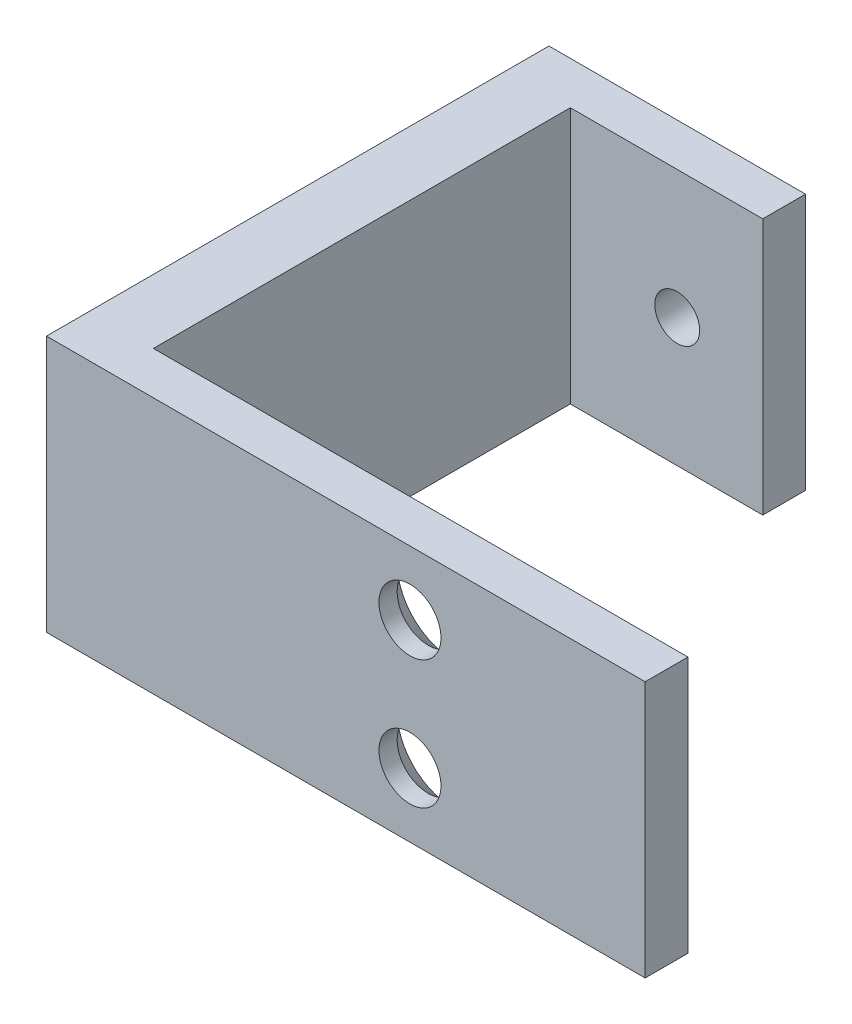
ISO-10303-21;
HEADER;
FILE_DESCRIPTION(('STEP AP214'),'2;1');
FILE_NAME('part.step','',(''),(''),'','','');
FILE_SCHEMA(('AUTOMOTIVE_DESIGN { 1 0 10303 214 1 1 1 1 }'));
ENDSEC;
DATA;
#1=APPLICATION_CONTEXT('core data for automotive mechanical design processes');
#2=APPLICATION_PROTOCOL_DEFINITION('international standard','automotive_design',2000,#1);
#3=PRODUCT_CONTEXT('',#1,'mechanical');
#4=PRODUCT('Part','Part','',(#3));
#5=PRODUCT_RELATED_PRODUCT_CATEGORY('part','',(#4));
#6=PRODUCT_DEFINITION_FORMATION('','',#4);
#7=PRODUCT_DEFINITION_CONTEXT('part definition',#1,'design');
#8=PRODUCT_DEFINITION('design','',#6,#7);
#9=PRODUCT_DEFINITION_SHAPE('','',#8);
#10=(LENGTH_UNIT() NAMED_UNIT(*) SI_UNIT(.MILLI.,.METRE.));
#11=(NAMED_UNIT(*) PLANE_ANGLE_UNIT() SI_UNIT($,.RADIAN.));
#12=(NAMED_UNIT(*) SI_UNIT($,.STERADIAN.) SOLID_ANGLE_UNIT());
#13=UNCERTAINTY_MEASURE_WITH_UNIT(LENGTH_MEASURE(1.E-05),#10,'distance_accuracy_value','');
#14=(GEOMETRIC_REPRESENTATION_CONTEXT(3) GLOBAL_UNCERTAINTY_ASSIGNED_CONTEXT((#13)) GLOBAL_UNIT_ASSIGNED_CONTEXT((#10,
#11,#12)) REPRESENTATION_CONTEXT('',''));
#15=CARTESIAN_POINT('',(0.,0.,0.));
#16=DIRECTION('',(0.,0.,1.));
#17=DIRECTION('',(1.,0.,0.));
#18=AXIS2_PLACEMENT_3D('',#15,#16,#17);
#19=CARTESIAN_POINT('',(-27.,-17.,0.01));
#20=DIRECTION('',(0.,0.,-1.));
#21=DIRECTION('',(-1.,0.,0.));
#22=AXIS2_PLACEMENT_3D('',#19,#20,#21);
#23=CYLINDRICAL_SURFACE('',#22,1.45);
#24=CARTESIAN_POINT('',(-27.,-17.,0.));
#25=DIRECTION('',(0.,0.,-1.));
#26=DIRECTION('',(-1.,0.,0.));
#27=AXIS2_PLACEMENT_3D('',#24,#25,#26);
#28=CIRCLE('',#27,1.45);
#29=CARTESIAN_POINT('',(-28.45,-17.,0.));
#30=VERTEX_POINT('',#29);
#31=EDGE_CURVE('E177',#30,#30,#28,.T.);
#32=ORIENTED_EDGE('',*,*,#31,.F.);
#33=EDGE_LOOP('',(#32));
#34=FACE_BOUND('',#33,.T.);
#35=CARTESIAN_POINT('',(-27.,-17.,-0.85));
#36=DIRECTION('',(0.,0.,-1.));
#37=DIRECTION('',(-1.,0.,0.));
#38=AXIS2_PLACEMENT_3D('',#35,#36,#37);
#39=CIRCLE('',#38,1.45);
#40=CARTESIAN_POINT('',(-28.45,-17.,-0.85));
#41=VERTEX_POINT('',#40);
#42=EDGE_CURVE('E195',#41,#41,#39,.T.);
#43=ORIENTED_EDGE('',*,*,#42,.T.);
#44=EDGE_LOOP('',(#43));
#45=FACE_BOUND('',#44,.T.);
#46=ADVANCED_FACE('F41',(#34,#45),#23,.F.);
#47=CARTESIAN_POINT('',(-27.,-23.,0.01));
#48=DIRECTION('',(0.,0.,-1.));
#49=DIRECTION('',(-1.,0.,0.));
#50=AXIS2_PLACEMENT_3D('',#47,#48,#49);
#51=CYLINDRICAL_SURFACE('',#50,1.45);
#52=CARTESIAN_POINT('',(-27.,-23.,0.));
#53=DIRECTION('',(0.,0.,-1.));
#54=DIRECTION('',(-1.,0.,0.));
#55=AXIS2_PLACEMENT_3D('',#52,#53,#54);
#56=CIRCLE('',#55,1.45);
#57=CARTESIAN_POINT('',(-28.45,-23.,0.));
#58=VERTEX_POINT('',#57);
#59=EDGE_CURVE('E44',#58,#58,#56,.T.);
#60=ORIENTED_EDGE('',*,*,#59,.F.);
#61=EDGE_LOOP('',(#60));
#62=FACE_BOUND('',#61,.T.);
#63=CARTESIAN_POINT('',(-27.,-23.,-0.85));
#64=DIRECTION('',(0.,0.,-1.));
#65=DIRECTION('',(-1.,0.,0.));
#66=AXIS2_PLACEMENT_3D('',#63,#64,#65);
#67=CIRCLE('',#66,1.45);
#68=CARTESIAN_POINT('',(-28.45,-23.,-0.85));
#69=VERTEX_POINT('',#68);
#70=EDGE_CURVE('E183',#69,#69,#67,.T.);
#71=ORIENTED_EDGE('',*,*,#70,.T.);
#72=EDGE_LOOP('',(#71));
#73=FACE_BOUND('',#72,.T.);
#74=ADVANCED_FACE('F245',(#62,#73),#51,.F.);
#75=CARTESIAN_POINT('',(0.,0.,-21.5));
#76=DIRECTION('',(0.,0.,-1.));
#77=DIRECTION('',(-1.,0.,0.));
#78=AXIS2_PLACEMENT_3D('',#75,#76,#77);
#79=PLANE('',#78);
#80=CARTESIAN_POINT('',(-36.,-20.,-21.5));
#81=DIRECTION('',(0.,0.,1.));
#82=DIRECTION('',(1.,0.,0.));
#83=AXIS2_PLACEMENT_3D('',#80,#81,#82);
#84=CIRCLE('',#83,1.05);
#85=CARTESIAN_POINT('',(-34.95,-20.,-21.5));
#86=VERTEX_POINT('',#85);
#87=EDGE_CURVE('E155',#86,#86,#84,.T.);
#88=ORIENTED_EDGE('',*,*,#87,.F.);
#89=EDGE_LOOP('',(#88));
#90=FACE_BOUND('',#89,.T.);
#91=DIRECTION('',(0.,1.,0.));
#92=VECTOR('',#91,1.);
#93=CARTESIAN_POINT('',(-41.,0.,-21.5));
#94=LINE('',#93,#92);
#95=CARTESIAN_POINT('',(-41.,-26.,-21.5));
#96=VERTEX_POINT('',#95);
#97=CARTESIAN_POINT('',(-41.,-14.,-21.5));
#98=VERTEX_POINT('',#97);
#99=EDGE_CURVE('E49',#96,#98,#94,.T.);
#100=ORIENTED_EDGE('',*,*,#99,.F.);
#101=DIRECTION('',(1.,0.,0.));
#102=VECTOR('',#101,1.);
#103=CARTESIAN_POINT('',(-44.,-26.,-21.5));
#104=LINE('',#103,#102);
#105=CARTESIAN_POINT('',(-32.,-26.,-21.5));
#106=VERTEX_POINT('',#105);
#107=EDGE_CURVE('E160',#96,#106,#104,.T.);
#108=ORIENTED_EDGE('',*,*,#107,.T.);
#109=DIRECTION('',(0.,1.,0.));
#110=VECTOR('',#109,1.);
#111=CARTESIAN_POINT('',(-32.,-26.,-21.5));
#112=LINE('',#111,#110);
#113=CARTESIAN_POINT('',(-32.,-14.,-21.5));
#114=VERTEX_POINT('',#113);
#115=EDGE_CURVE('E159',#106,#114,#112,.T.);
#116=ORIENTED_EDGE('',*,*,#115,.T.);
#117=DIRECTION('',(-1.,0.,0.));
#118=VECTOR('',#117,1.);
#119=CARTESIAN_POINT('',(-44.,-14.,-21.5));
#120=LINE('',#119,#118);
#121=EDGE_CURVE('E165',#114,#98,#120,.T.);
#122=ORIENTED_EDGE('',*,*,#121,.T.);
#123=EDGE_LOOP('',(#100,#108,#116,#122));
#124=FACE_BOUND('',#123,.T.);
#125=ADVANCED_FACE('F214',(#90,#124),#79,.F.);
#126=CARTESIAN_POINT('',(0.,0.,-23.5));
#127=DIRECTION('',(0.,0.,-1.));
#128=DIRECTION('',(-1.,0.,0.));
#129=AXIS2_PLACEMENT_3D('',#126,#127,#128);
#130=PLANE('',#129);
#131=DIRECTION('',(0.,-1.,0.));
#132=VECTOR('',#131,1.);
#133=CARTESIAN_POINT('',(-44.,-26.,-23.5));
#134=LINE('',#133,#132);
#135=CARTESIAN_POINT('',(-44.,-14.,-23.5));
#136=VERTEX_POINT('',#135);
#137=CARTESIAN_POINT('',(-44.,-26.,-23.5));
#138=VERTEX_POINT('',#137);
#139=EDGE_CURVE('E111',#136,#138,#134,.T.);
#140=ORIENTED_EDGE('',*,*,#139,.F.);
#141=DIRECTION('',(-1.,0.,0.));
#142=VECTOR('',#141,1.);
#143=CARTESIAN_POINT('',(-44.,-14.,-23.5));
#144=LINE('',#143,#142);
#145=CARTESIAN_POINT('',(-32.,-14.,-23.5));
#146=VERTEX_POINT('',#145);
#147=EDGE_CURVE('E158',#146,#136,#144,.T.);
#148=ORIENTED_EDGE('',*,*,#147,.F.);
#149=DIRECTION('',(0.,1.,0.));
#150=VECTOR('',#149,1.);
#151=CARTESIAN_POINT('',(-32.,-26.,-23.5));
#152=LINE('',#151,#150);
#153=CARTESIAN_POINT('',(-32.,-26.,-23.5));
#154=VERTEX_POINT('',#153);
#155=EDGE_CURVE('E170',#154,#146,#152,.T.);
#156=ORIENTED_EDGE('',*,*,#155,.F.);
#157=DIRECTION('',(1.,0.,0.));
#158=VECTOR('',#157,1.);
#159=CARTESIAN_POINT('',(-44.,-26.,-23.5));
#160=LINE('',#159,#158);
#161=EDGE_CURVE('E169',#138,#154,#160,.T.);
#162=ORIENTED_EDGE('',*,*,#161,.F.);
#163=EDGE_LOOP('',(#140,#148,#156,#162));
#164=FACE_BOUND('',#163,.T.);
#165=CARTESIAN_POINT('',(-36.,-20.,-23.5));
#166=DIRECTION('',(0.,0.,1.));
#167=DIRECTION('',(1.,0.,0.));
#168=AXIS2_PLACEMENT_3D('',#165,#166,#167);
#169=CIRCLE('',#168,1.05);
#170=CARTESIAN_POINT('',(-34.95,-20.,-23.5));
#171=VERTEX_POINT('',#170);
#172=EDGE_CURVE('E153',#171,#171,#169,.T.);
#173=ORIENTED_EDGE('',*,*,#172,.T.);
#174=EDGE_LOOP('',(#173));
#175=FACE_BOUND('',#174,.T.);
#176=ADVANCED_FACE('F222',(#164,#175),#130,.T.);
#177=CARTESIAN_POINT('',(-44.,-26.,-21.5));
#178=DIRECTION('',(1.,0.,0.));
#179=DIRECTION('',(0.,0.,-1.));
#180=AXIS2_PLACEMENT_3D('',#177,#178,#179);
#181=PLANE('',#180);
#182=DIRECTION('',(0.,0.,-1.));
#183=VECTOR('',#182,1.);
#184=CARTESIAN_POINT('',(-44.,-14.,-21.5));
#185=LINE('',#184,#183);
#186=CARTESIAN_POINT('',(-44.,-14.,0.));
#187=VERTEX_POINT('',#186);
#188=EDGE_CURVE('E164',#187,#136,#185,.T.);
#189=ORIENTED_EDGE('',*,*,#188,.T.);
#190=ORIENTED_EDGE('',*,*,#139,.T.);
#191=DIRECTION('',(0.,0.,-1.));
#192=VECTOR('',#191,1.);
#193=CARTESIAN_POINT('',(-44.,-26.,-21.5));
#194=LINE('',#193,#192);
#195=CARTESIAN_POINT('',(-44.,-26.,0.));
#196=VERTEX_POINT('',#195);
#197=EDGE_CURVE('E106',#196,#138,#194,.T.);
#198=ORIENTED_EDGE('',*,*,#197,.F.);
#199=DIRECTION('',(0.,-1.,0.));
#200=VECTOR('',#199,1.);
#201=CARTESIAN_POINT('',(-44.,-26.,0.));
#202=LINE('',#201,#200);
#203=EDGE_CURVE('E113',#187,#196,#202,.T.);
#204=ORIENTED_EDGE('',*,*,#203,.F.);
#205=EDGE_LOOP('',(#189,#190,#198,#204));
#206=FACE_BOUND('',#205,.T.);
#207=ADVANCED_FACE('F43',(#206),#181,.F.);
#208=CARTESIAN_POINT('',(-44.,-26.,-21.5));
#209=DIRECTION('',(0.,1.,0.));
#210=DIRECTION('',(0.,0.,1.));
#211=AXIS2_PLACEMENT_3D('',#208,#209,#210);
#212=PLANE('',#211);
#213=DIRECTION('',(0.,0.,-1.));
#214=VECTOR('',#213,1.);
#215=CARTESIAN_POINT('',(-41.,-26.,-1.));
#216=LINE('',#215,#214);
#217=CARTESIAN_POINT('',(-41.,-26.,-2.));
#218=VERTEX_POINT('',#217);
#219=EDGE_CURVE('E63',#218,#96,#216,.T.);
#220=ORIENTED_EDGE('',*,*,#219,.F.);
#221=DIRECTION('',(1.,0.,0.));
#222=VECTOR('',#221,1.);
#223=CARTESIAN_POINT('',(-44.,-26.,-2.));
#224=LINE('',#223,#222);
#225=CARTESIAN_POINT('',(-16.,-26.,-2.));
#226=VERTEX_POINT('',#225);
#227=EDGE_CURVE('E59',#218,#226,#224,.T.);
#228=ORIENTED_EDGE('',*,*,#227,.T.);
#229=DIRECTION('',(0.,0.,-1.));
#230=VECTOR('',#229,1.);
#231=CARTESIAN_POINT('',(-16.,-26.,0.));
#232=LINE('',#231,#230);
#233=CARTESIAN_POINT('',(-16.,-26.,0.));
#234=VERTEX_POINT('',#233);
#235=EDGE_CURVE('E125',#234,#226,#232,.T.);
#236=ORIENTED_EDGE('',*,*,#235,.F.);
#237=DIRECTION('',(1.,0.,0.));
#238=VECTOR('',#237,1.);
#239=CARTESIAN_POINT('',(-44.,-26.,0.));
#240=LINE('',#239,#238);
#241=EDGE_CURVE('E117',#196,#234,#240,.T.);
#242=ORIENTED_EDGE('',*,*,#241,.F.);
#243=ORIENTED_EDGE('',*,*,#197,.T.);
#244=ORIENTED_EDGE('',*,*,#161,.T.);
#245=DIRECTION('',(0.,0.,-1.));
#246=VECTOR('',#245,1.);
#247=CARTESIAN_POINT('',(-32.,-26.,-21.5));
#248=LINE('',#247,#246);
#249=EDGE_CURVE('E116',#106,#154,#248,.T.);
#250=ORIENTED_EDGE('',*,*,#249,.F.);
#251=ORIENTED_EDGE('',*,*,#107,.F.);
#252=EDGE_LOOP('',(#220,#228,#236,#242,#243,#244,#250,#251));
#253=FACE_BOUND('',#252,.T.);
#254=ADVANCED_FACE('F119',(#253),#212,.F.);
#255=CARTESIAN_POINT('',(-32.,-26.,-21.5));
#256=DIRECTION('',(-1.,0.,0.));
#257=DIRECTION('',(0.,0.,1.));
#258=AXIS2_PLACEMENT_3D('',#255,#256,#257);
#259=PLANE('',#258);
#260=ORIENTED_EDGE('',*,*,#155,.T.);
#261=DIRECTION('',(0.,0.,-1.));
#262=VECTOR('',#261,1.);
#263=CARTESIAN_POINT('',(-32.,-14.,-21.5));
#264=LINE('',#263,#262);
#265=EDGE_CURVE('E172',#114,#146,#264,.T.);
#266=ORIENTED_EDGE('',*,*,#265,.F.);
#267=ORIENTED_EDGE('',*,*,#115,.F.);
#268=ORIENTED_EDGE('',*,*,#249,.T.);
#269=EDGE_LOOP('',(#260,#266,#267,#268));
#270=FACE_BOUND('',#269,.T.);
#271=ADVANCED_FACE('F221',(#270),#259,.F.);
#272=CARTESIAN_POINT('',(-44.,-14.,-21.5));
#273=DIRECTION('',(0.,-1.,0.));
#274=DIRECTION('',(0.,0.,-1.));
#275=AXIS2_PLACEMENT_3D('',#272,#273,#274);
#276=PLANE('',#275);
#277=ORIENTED_EDGE('',*,*,#188,.F.);
#278=DIRECTION('',(-1.,0.,0.));
#279=VECTOR('',#278,1.);
#280=CARTESIAN_POINT('',(-44.,-14.,0.));
#281=LINE('',#280,#279);
#282=CARTESIAN_POINT('',(-16.,-14.,0.));
#283=VERTEX_POINT('',#282);
#284=EDGE_CURVE('E129',#283,#187,#281,.T.);
#285=ORIENTED_EDGE('',*,*,#284,.F.);
#286=DIRECTION('',(0.,0.,-1.));
#287=VECTOR('',#286,1.);
#288=CARTESIAN_POINT('',(-16.,-14.,0.));
#289=LINE('',#288,#287);
#290=CARTESIAN_POINT('',(-16.,-14.,-2.));
#291=VERTEX_POINT('',#290);
#292=EDGE_CURVE('E144',#283,#291,#289,.T.);
#293=ORIENTED_EDGE('',*,*,#292,.T.);
#294=DIRECTION('',(-1.,0.,0.));
#295=VECTOR('',#294,1.);
#296=CARTESIAN_POINT('',(-44.,-14.,-2.));
#297=LINE('',#296,#295);
#298=CARTESIAN_POINT('',(-41.,-14.,-2.));
#299=VERTEX_POINT('',#298);
#300=EDGE_CURVE('E132',#291,#299,#297,.T.);
#301=ORIENTED_EDGE('',*,*,#300,.T.);
#302=DIRECTION('',(0.,0.,-1.));
#303=VECTOR('',#302,1.);
#304=CARTESIAN_POINT('',(-41.,-14.,-1.));
#305=LINE('',#304,#303);
#306=EDGE_CURVE('E148',#299,#98,#305,.T.);
#307=ORIENTED_EDGE('',*,*,#306,.T.);
#308=ORIENTED_EDGE('',*,*,#121,.F.);
#309=ORIENTED_EDGE('',*,*,#265,.T.);
#310=ORIENTED_EDGE('',*,*,#147,.T.);
#311=EDGE_LOOP('',(#277,#285,#293,#301,#307,#308,#309,#310));
#312=FACE_BOUND('',#311,.T.);
#313=ADVANCED_FACE('F208',(#312),#276,.F.);
#314=CARTESIAN_POINT('',(-36.,-20.,-21.5));
#315=DIRECTION('',(0.,0.,-1.));
#316=DIRECTION('',(-1.,0.,0.));
#317=AXIS2_PLACEMENT_3D('',#314,#315,#316);
#318=CYLINDRICAL_SURFACE('',#317,1.05);
#319=ORIENTED_EDGE('',*,*,#87,.T.);
#320=EDGE_LOOP('',(#319));
#321=FACE_BOUND('',#320,.T.);
#322=ORIENTED_EDGE('',*,*,#172,.F.);
#323=EDGE_LOOP('',(#322));
#324=FACE_BOUND('',#323,.T.);
#325=ADVANCED_FACE('F229',(#321,#324),#318,.F.);
#326=CARTESIAN_POINT('',(-41.,-26.,-1.));
#327=DIRECTION('',(-1.,0.,0.));
#328=DIRECTION('',(0.,0.,1.));
#329=AXIS2_PLACEMENT_3D('',#326,#327,#328);
#330=PLANE('',#329);
#331=ORIENTED_EDGE('',*,*,#306,.F.);
#332=DIRECTION('',(0.,-1.,0.));
#333=VECTOR('',#332,1.);
#334=CARTESIAN_POINT('',(-41.,-26.,-2.));
#335=LINE('',#334,#333);
#336=EDGE_CURVE('E11',#299,#218,#335,.T.);
#337=ORIENTED_EDGE('',*,*,#336,.T.);
#338=ORIENTED_EDGE('',*,*,#219,.T.);
#339=ORIENTED_EDGE('',*,*,#99,.T.);
#340=EDGE_LOOP('',(#331,#337,#338,#339));
#341=FACE_BOUND('',#340,.T.);
#342=ADVANCED_FACE('F203',(#341),#330,.F.);
#343=CARTESIAN_POINT('',(0.,0.,-2.));
#344=DIRECTION('',(0.,0.,-1.));
#345=DIRECTION('',(-1.,0.,0.));
#346=AXIS2_PLACEMENT_3D('',#343,#344,#345);
#347=PLANE('',#346);
#348=CARTESIAN_POINT('',(-27.,-23.,-2.));
#349=DIRECTION('',(0.,0.,-1.));
#350=DIRECTION('',(-1.,0.,0.));
#351=AXIS2_PLACEMENT_3D('',#348,#349,#350);
#352=CIRCLE('',#351,2.6);
#353=CARTESIAN_POINT('',(-29.6,-23.,-2.));
#354=VERTEX_POINT('',#353);
#355=EDGE_CURVE('E188',#354,#354,#352,.T.);
#356=ORIENTED_EDGE('',*,*,#355,.F.);
#357=EDGE_LOOP('',(#356));
#358=FACE_BOUND('',#357,.T.);
#359=CARTESIAN_POINT('',(-27.,-17.,-2.));
#360=DIRECTION('',(0.,0.,-1.));
#361=DIRECTION('',(-1.,0.,0.));
#362=AXIS2_PLACEMENT_3D('',#359,#360,#361);
#363=CIRCLE('',#362,2.6);
#364=CARTESIAN_POINT('',(-29.6,-17.,-2.));
#365=VERTEX_POINT('',#364);
#366=EDGE_CURVE('E140',#365,#365,#363,.T.);
#367=ORIENTED_EDGE('',*,*,#366,.F.);
#368=EDGE_LOOP('',(#367));
#369=FACE_BOUND('',#368,.T.);
#370=ORIENTED_EDGE('',*,*,#336,.F.);
#371=ORIENTED_EDGE('',*,*,#300,.F.);
#372=DIRECTION('',(0.,1.,0.));
#373=VECTOR('',#372,1.);
#374=CARTESIAN_POINT('',(-16.,-26.,-2.));
#375=LINE('',#374,#373);
#376=EDGE_CURVE('E131',#226,#291,#375,.T.);
#377=ORIENTED_EDGE('',*,*,#376,.F.);
#378=ORIENTED_EDGE('',*,*,#227,.F.);
#379=EDGE_LOOP('',(#370,#371,#377,#378));
#380=FACE_BOUND('',#379,.T.);
#381=ADVANCED_FACE('F201',(#358,#369,#380),#347,.T.);
#382=CARTESIAN_POINT('',(-16.,-26.,0.));
#383=DIRECTION('',(-1.,0.,0.));
#384=DIRECTION('',(0.,0.,1.));
#385=AXIS2_PLACEMENT_3D('',#382,#383,#384);
#386=PLANE('',#385);
#387=ORIENTED_EDGE('',*,*,#376,.T.);
#388=ORIENTED_EDGE('',*,*,#292,.F.);
#389=DIRECTION('',(0.,1.,0.));
#390=VECTOR('',#389,1.);
#391=CARTESIAN_POINT('',(-16.,-26.,0.));
#392=LINE('',#391,#390);
#393=EDGE_CURVE('E124',#234,#283,#392,.T.);
#394=ORIENTED_EDGE('',*,*,#393,.F.);
#395=ORIENTED_EDGE('',*,*,#235,.T.);
#396=EDGE_LOOP('',(#387,#388,#394,#395));
#397=FACE_BOUND('',#396,.T.);
#398=ADVANCED_FACE('F202',(#397),#386,.F.);
#399=CARTESIAN_POINT('',(0.,0.,0.));
#400=DIRECTION('',(0.,0.,-1.));
#401=DIRECTION('',(-1.,0.,0.));
#402=AXIS2_PLACEMENT_3D('',#399,#400,#401);
#403=PLANE('',#402);
#404=ORIENTED_EDGE('',*,*,#59,.T.);
#405=EDGE_LOOP('',(#404));
#406=FACE_BOUND('',#405,.T.);
#407=ORIENTED_EDGE('',*,*,#31,.T.);
#408=EDGE_LOOP('',(#407));
#409=FACE_BOUND('',#408,.T.);
#410=ORIENTED_EDGE('',*,*,#203,.T.);
#411=ORIENTED_EDGE('',*,*,#241,.T.);
#412=ORIENTED_EDGE('',*,*,#393,.T.);
#413=ORIENTED_EDGE('',*,*,#284,.T.);
#414=EDGE_LOOP('',(#410,#411,#412,#413));
#415=FACE_BOUND('',#414,.T.);
#416=ADVANCED_FACE('F127',(#406,#409,#415),#403,.F.);
#417=CARTESIAN_POINT('',(-27.,-23.,-2.));
#418=DIRECTION('',(0.,0.,-1.));
#419=DIRECTION('',(-1.,0.,0.));
#420=AXIS2_PLACEMENT_3D('',#417,#418,#419);
#421=CONICAL_SURFACE('',#420,2.6,0.785398163397448);
#422=ORIENTED_EDGE('',*,*,#70,.F.);
#423=EDGE_LOOP('',(#422));
#424=FACE_BOUND('',#423,.T.);
#425=ORIENTED_EDGE('',*,*,#355,.T.);
#426=EDGE_LOOP('',(#425));
#427=FACE_BOUND('',#426,.T.);
#428=ADVANCED_FACE('F254',(#424,#427),#421,.F.);
#429=CARTESIAN_POINT('',(-27.,-17.,-2.));
#430=DIRECTION('',(0.,0.,-1.));
#431=DIRECTION('',(-1.,0.,0.));
#432=AXIS2_PLACEMENT_3D('',#429,#430,#431);
#433=CONICAL_SURFACE('',#432,2.6,0.785398163397448);
#434=ORIENTED_EDGE('',*,*,#42,.F.);
#435=EDGE_LOOP('',(#434));
#436=FACE_BOUND('',#435,.T.);
#437=ORIENTED_EDGE('',*,*,#366,.T.);
#438=EDGE_LOOP('',(#437));
#439=FACE_BOUND('',#438,.T.);
#440=ADVANCED_FACE('F197',(#436,#439),#433,.F.);
#441=CLOSED_SHELL('',(#46,#74,#125,#176,#207,#254,#271,#313,#325,#342,#381,#398,#416,#428,#440));
#442=MANIFOLD_SOLID_BREP('B2',#441);
#443=ADVANCED_BREP_SHAPE_REPRESENTATION('',(#18,#442),#14);
#444=SHAPE_DEFINITION_REPRESENTATION(#9,#443);
ENDSEC;
END-ISO-10303-21;
